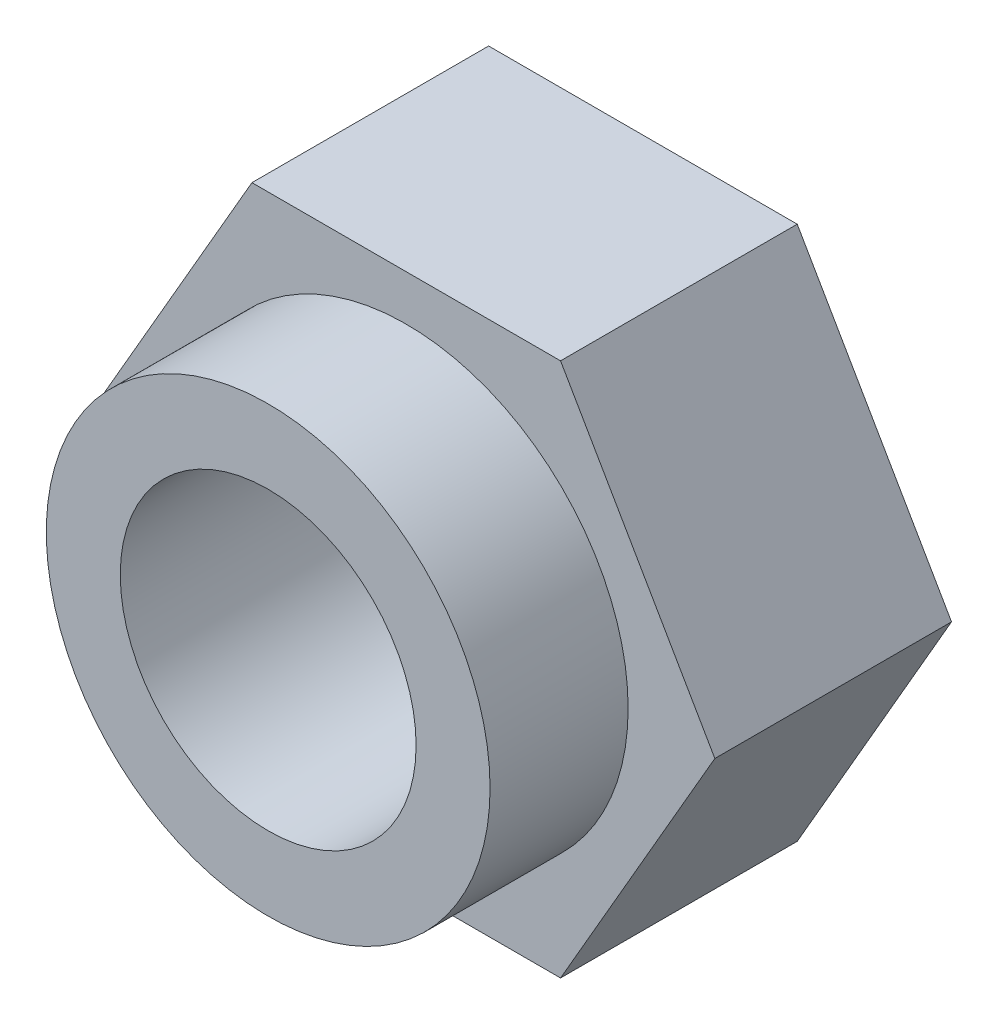
ISO-10303-21;
HEADER;
FILE_DESCRIPTION(('STEP AP214'),'2;1');
FILE_NAME('part.step','',(''),(''),'','','');
FILE_SCHEMA(('AUTOMOTIVE_DESIGN { 1 0 10303 214 1 1 1 1 }'));
ENDSEC;
DATA;
#1=APPLICATION_CONTEXT('core data for automotive mechanical design processes');
#2=APPLICATION_PROTOCOL_DEFINITION('international standard','automotive_design',2000,#1);
#3=PRODUCT_CONTEXT('',#1,'mechanical');
#4=PRODUCT('Part','Part','',(#3));
#5=PRODUCT_RELATED_PRODUCT_CATEGORY('part','',(#4));
#6=PRODUCT_DEFINITION_FORMATION('','',#4);
#7=PRODUCT_DEFINITION_CONTEXT('part definition',#1,'design');
#8=PRODUCT_DEFINITION('design','',#6,#7);
#9=PRODUCT_DEFINITION_SHAPE('','',#8);
#10=(LENGTH_UNIT() NAMED_UNIT(*) SI_UNIT(.MILLI.,.METRE.));
#11=(NAMED_UNIT(*) PLANE_ANGLE_UNIT() SI_UNIT($,.RADIAN.));
#12=(NAMED_UNIT(*) SI_UNIT($,.STERADIAN.) SOLID_ANGLE_UNIT());
#13=UNCERTAINTY_MEASURE_WITH_UNIT(LENGTH_MEASURE(1.E-05),#10,'distance_accuracy_value','');
#14=(GEOMETRIC_REPRESENTATION_CONTEXT(3) GLOBAL_UNCERTAINTY_ASSIGNED_CONTEXT((#13)) GLOBAL_UNIT_ASSIGNED_CONTEXT((#10,
#11,#12)) REPRESENTATION_CONTEXT('',''));
#15=CARTESIAN_POINT('',(0.,0.,0.));
#16=DIRECTION('',(0.,0.,1.));
#17=DIRECTION('',(1.,0.,0.));
#18=AXIS2_PLACEMENT_3D('',#15,#16,#17);
#19=CARTESIAN_POINT('',(1.56461922950391,-2.70999999999997,2.4));
#20=DIRECTION('',(-0.866025403784441,0.499999999999995,0.));
#21=DIRECTION('',(-0.499999999999995,-0.866025403784442,0.));
#22=AXIS2_PLACEMENT_3D('',#19,#20,#21);
#23=PLANE('',#22);
#24=DIRECTION('',(0.499999999999995,0.866025403784442,0.));
#25=VECTOR('',#24,1.);
#26=CARTESIAN_POINT('',(1.56461922950391,-2.70999999999997,0.));
#27=LINE('',#26,#25);
#28=CARTESIAN_POINT('',(1.56461922950391,-2.70999999999997,0.));
#29=VERTEX_POINT('',#28);
#30=CARTESIAN_POINT('',(3.12923845900776,0.,0.));
#31=VERTEX_POINT('',#30);
#32=EDGE_CURVE('E120',#29,#31,#27,.T.);
#33=ORIENTED_EDGE('',*,*,#32,.T.);
#34=DIRECTION('',(0.,0.,-1.));
#35=VECTOR('',#34,1.);
#36=CARTESIAN_POINT('',(3.12923845900776,0.,2.4));
#37=LINE('',#36,#35);
#38=CARTESIAN_POINT('',(3.12923845900776,0.,2.4));
#39=VERTEX_POINT('',#38);
#40=EDGE_CURVE('E37',#39,#31,#37,.T.);
#41=ORIENTED_EDGE('',*,*,#40,.F.);
#42=DIRECTION('',(0.499999999999995,0.866025403784442,0.));
#43=VECTOR('',#42,1.);
#44=CARTESIAN_POINT('',(1.56461922950391,-2.70999999999997,2.4));
#45=LINE('',#44,#43);
#46=CARTESIAN_POINT('',(1.56461922950391,-2.70999999999997,2.4));
#47=VERTEX_POINT('',#46);
#48=EDGE_CURVE('E131',#47,#39,#45,.T.);
#49=ORIENTED_EDGE('',*,*,#48,.F.);
#50=DIRECTION('',(0.,0.,-1.));
#51=VECTOR('',#50,1.);
#52=CARTESIAN_POINT('',(1.56461922950391,-2.70999999999997,2.4));
#53=LINE('',#52,#51);
#54=EDGE_CURVE('E116',#47,#29,#53,.T.);
#55=ORIENTED_EDGE('',*,*,#54,.T.);
#56=EDGE_LOOP('',(#33,#41,#49,#55));
#57=FACE_BOUND('',#56,.T.);
#58=ADVANCED_FACE('F34',(#57),#23,.F.);
#59=CARTESIAN_POINT('',(3.12923845900776,0.,2.4));
#60=DIRECTION('',(-0.866025403784438,-0.500000000000001,0.));
#61=DIRECTION('',(0.500000000000001,-0.866025403784438,0.));
#62=AXIS2_PLACEMENT_3D('',#59,#60,#61);
#63=PLANE('',#62);
#64=DIRECTION('',(-0.500000000000001,0.866025403784438,0.));
#65=VECTOR('',#64,1.);
#66=CARTESIAN_POINT('',(3.12923845900776,0.,0.));
#67=LINE('',#66,#65);
#68=CARTESIAN_POINT('',(1.56461922950387,2.70999999999999,0.));
#69=VERTEX_POINT('',#68);
#70=EDGE_CURVE('E123',#31,#69,#67,.T.);
#71=ORIENTED_EDGE('',*,*,#70,.T.);
#72=DIRECTION('',(0.,0.,-1.));
#73=VECTOR('',#72,1.);
#74=CARTESIAN_POINT('',(1.56461922950387,2.70999999999999,2.4));
#75=LINE('',#74,#73);
#76=CARTESIAN_POINT('',(1.56461922950387,2.70999999999999,2.4));
#77=VERTEX_POINT('',#76);
#78=EDGE_CURVE('E134',#77,#69,#75,.T.);
#79=ORIENTED_EDGE('',*,*,#78,.F.);
#80=DIRECTION('',(-0.500000000000001,0.866025403784438,0.));
#81=VECTOR('',#80,1.);
#82=CARTESIAN_POINT('',(3.12923845900776,0.,2.4));
#83=LINE('',#82,#81);
#84=EDGE_CURVE('E89',#39,#77,#83,.T.);
#85=ORIENTED_EDGE('',*,*,#84,.F.);
#86=ORIENTED_EDGE('',*,*,#40,.T.);
#87=EDGE_LOOP('',(#71,#79,#85,#86));
#88=FACE_BOUND('',#87,.T.);
#89=ADVANCED_FACE('F139',(#88),#63,.F.);
#90=CARTESIAN_POINT('',(1.56461922950387,2.70999999999999,2.4));
#91=DIRECTION('',(0.,-1.,0.));
#92=DIRECTION('',(1.,0.,0.));
#93=AXIS2_PLACEMENT_3D('',#90,#91,#92);
#94=PLANE('',#93);
#95=DIRECTION('',(-1.,0.,0.));
#96=VECTOR('',#95,1.);
#97=CARTESIAN_POINT('',(1.56461922950387,2.70999999999999,0.));
#98=LINE('',#97,#96);
#99=CARTESIAN_POINT('',(-1.56461922950389,2.70999999999998,0.));
#100=VERTEX_POINT('',#99);
#101=EDGE_CURVE('E126',#69,#100,#98,.T.);
#102=ORIENTED_EDGE('',*,*,#101,.T.);
#103=DIRECTION('',(0.,0.,-1.));
#104=VECTOR('',#103,1.);
#105=CARTESIAN_POINT('',(-1.56461922950389,2.70999999999998,2.4));
#106=LINE('',#105,#104);
#107=CARTESIAN_POINT('',(-1.56461922950389,2.70999999999998,2.4));
#108=VERTEX_POINT('',#107);
#109=EDGE_CURVE('E111',#108,#100,#106,.T.);
#110=ORIENTED_EDGE('',*,*,#109,.F.);
#111=DIRECTION('',(-1.,0.,0.));
#112=VECTOR('',#111,1.);
#113=CARTESIAN_POINT('',(1.56461922950387,2.70999999999999,2.4));
#114=LINE('',#113,#112);
#115=EDGE_CURVE('E102',#77,#108,#114,.T.);
#116=ORIENTED_EDGE('',*,*,#115,.F.);
#117=ORIENTED_EDGE('',*,*,#78,.T.);
#118=EDGE_LOOP('',(#102,#110,#116,#117));
#119=FACE_BOUND('',#118,.T.);
#120=ADVANCED_FACE('F145',(#119),#94,.F.);
#121=CARTESIAN_POINT('',(-1.56461922950389,2.70999999999998,2.4));
#122=DIRECTION('',(0.866025403784441,-0.499999999999995,0.));
#123=DIRECTION('',(0.499999999999995,0.866025403784442,0.));
#124=AXIS2_PLACEMENT_3D('',#121,#122,#123);
#125=PLANE('',#124);
#126=DIRECTION('',(-0.499999999999995,-0.866025403784441,0.));
#127=VECTOR('',#126,1.);
#128=CARTESIAN_POINT('',(-1.56461922950389,2.70999999999998,0.));
#129=LINE('',#128,#127);
#130=CARTESIAN_POINT('',(-3.12923845900776,0.,0.));
#131=VERTEX_POINT('',#130);
#132=EDGE_CURVE('E110',#100,#131,#129,.T.);
#133=ORIENTED_EDGE('',*,*,#132,.T.);
#134=DIRECTION('',(0.,0.,-1.));
#135=VECTOR('',#134,1.);
#136=CARTESIAN_POINT('',(-3.12923845900776,0.,2.4));
#137=LINE('',#136,#135);
#138=CARTESIAN_POINT('',(-3.12923845900776,0.,2.4));
#139=VERTEX_POINT('',#138);
#140=EDGE_CURVE('E107',#139,#131,#137,.T.);
#141=ORIENTED_EDGE('',*,*,#140,.F.);
#142=DIRECTION('',(-0.499999999999995,-0.866025403784441,0.));
#143=VECTOR('',#142,1.);
#144=CARTESIAN_POINT('',(-1.56461922950389,2.70999999999998,2.4));
#145=LINE('',#144,#143);
#146=EDGE_CURVE('E96',#108,#139,#145,.T.);
#147=ORIENTED_EDGE('',*,*,#146,.F.);
#148=ORIENTED_EDGE('',*,*,#109,.T.);
#149=EDGE_LOOP('',(#133,#141,#147,#148));
#150=FACE_BOUND('',#149,.T.);
#151=ADVANCED_FACE('F108',(#150),#125,.F.);
#152=CARTESIAN_POINT('',(-3.12923845900776,0.,2.4));
#153=DIRECTION('',(0.866025403784434,0.500000000000007,0.));
#154=DIRECTION('',(-0.500000000000007,0.866025403784435,0.));
#155=AXIS2_PLACEMENT_3D('',#152,#153,#154);
#156=PLANE('',#155);
#157=DIRECTION('',(0.500000000000007,-0.866025403784435,0.));
#158=VECTOR('',#157,1.);
#159=CARTESIAN_POINT('',(-3.12923845900776,0.,0.));
#160=LINE('',#159,#158);
#161=CARTESIAN_POINT('',(-1.56461922950386,-2.71000000000001,0.));
#162=VERTEX_POINT('',#161);
#163=EDGE_CURVE('E74',#131,#162,#160,.T.);
#164=ORIENTED_EDGE('',*,*,#163,.T.);
#165=DIRECTION('',(0.,0.,-1.));
#166=VECTOR('',#165,1.);
#167=CARTESIAN_POINT('',(-1.56461922950386,-2.71000000000001,2.4));
#168=LINE('',#167,#166);
#169=CARTESIAN_POINT('',(-1.56461922950386,-2.71000000000001,2.4));
#170=VERTEX_POINT('',#169);
#171=EDGE_CURVE('E112',#170,#162,#168,.T.);
#172=ORIENTED_EDGE('',*,*,#171,.F.);
#173=DIRECTION('',(0.500000000000007,-0.866025403784435,0.));
#174=VECTOR('',#173,1.);
#175=CARTESIAN_POINT('',(-3.12923845900776,0.,2.4));
#176=LINE('',#175,#174);
#177=EDGE_CURVE('E100',#139,#170,#176,.T.);
#178=ORIENTED_EDGE('',*,*,#177,.F.);
#179=ORIENTED_EDGE('',*,*,#140,.T.);
#180=EDGE_LOOP('',(#164,#172,#178,#179));
#181=FACE_BOUND('',#180,.T.);
#182=ADVANCED_FACE('F114',(#181),#156,.F.);
#183=CARTESIAN_POINT('',(-1.56461922950386,-2.71000000000001,2.4));
#184=DIRECTION('',(0.,1.,0.));
#185=DIRECTION('',(-1.,0.,0.));
#186=AXIS2_PLACEMENT_3D('',#183,#184,#185);
#187=PLANE('',#186);
#188=DIRECTION('',(1.,0.,0.));
#189=VECTOR('',#188,1.);
#190=CARTESIAN_POINT('',(-1.56461922950386,-2.71000000000001,0.));
#191=LINE('',#190,#189);
#192=EDGE_CURVE('E80',#162,#29,#191,.T.);
#193=ORIENTED_EDGE('',*,*,#192,.T.);
#194=ORIENTED_EDGE('',*,*,#54,.F.);
#195=DIRECTION('',(1.,0.,0.));
#196=VECTOR('',#195,1.);
#197=CARTESIAN_POINT('',(-1.56461922950386,-2.71000000000001,2.4));
#198=LINE('',#197,#196);
#199=EDGE_CURVE('E51',#170,#47,#198,.T.);
#200=ORIENTED_EDGE('',*,*,#199,.F.);
#201=ORIENTED_EDGE('',*,*,#171,.T.);
#202=EDGE_LOOP('',(#193,#194,#200,#201));
#203=FACE_BOUND('',#202,.T.);
#204=ADVANCED_FACE('F174',(#203),#187,.F.);
#205=CARTESIAN_POINT('',(0.,0.,2.4));
#206=DIRECTION('',(0.,0.,1.));
#207=DIRECTION('',(1.,0.,0.));
#208=AXIS2_PLACEMENT_3D('',#205,#206,#207);
#209=PLANE('',#208);
#210=CARTESIAN_POINT('',(0.,0.,2.4));
#211=DIRECTION('',(0.,0.,1.));
#212=DIRECTION('',(1.,0.,0.));
#213=AXIS2_PLACEMENT_3D('',#210,#211,#212);
#214=CIRCLE('',#213,2.25);
#215=CARTESIAN_POINT('',(2.25,0.,2.4));
#216=VERTEX_POINT('',#215);
#217=EDGE_CURVE('E11',#216,#216,#214,.T.);
#218=ORIENTED_EDGE('',*,*,#217,.F.);
#219=EDGE_LOOP('',(#218));
#220=FACE_BOUND('',#219,.T.);
#221=ORIENTED_EDGE('',*,*,#48,.T.);
#222=ORIENTED_EDGE('',*,*,#84,.T.);
#223=ORIENTED_EDGE('',*,*,#115,.T.);
#224=ORIENTED_EDGE('',*,*,#146,.T.);
#225=ORIENTED_EDGE('',*,*,#177,.T.);
#226=ORIENTED_EDGE('',*,*,#199,.T.);
#227=EDGE_LOOP('',(#221,#222,#223,#224,#225,#226));
#228=FACE_BOUND('',#227,.T.);
#229=ADVANCED_FACE('F98',(#220,#228),#209,.T.);
#230=CARTESIAN_POINT('',(0.,0.,0.));
#231=DIRECTION('',(0.,0.,1.));
#232=DIRECTION('',(1.,0.,0.));
#233=AXIS2_PLACEMENT_3D('',#230,#231,#232);
#234=PLANE('',#233);
#235=CARTESIAN_POINT('',(0.,0.,0.));
#236=DIRECTION('',(0.,0.,1.));
#237=DIRECTION('',(1.,0.,0.));
#238=AXIS2_PLACEMENT_3D('',#235,#236,#237);
#239=CIRCLE('',#238,1.5);
#240=CARTESIAN_POINT('',(1.5,0.,0.));
#241=VERTEX_POINT('',#240);
#242=EDGE_CURVE('E151',#241,#241,#239,.T.);
#243=ORIENTED_EDGE('',*,*,#242,.T.);
#244=EDGE_LOOP('',(#243));
#245=FACE_BOUND('',#244,.T.);
#246=ORIENTED_EDGE('',*,*,#32,.F.);
#247=ORIENTED_EDGE('',*,*,#192,.F.);
#248=ORIENTED_EDGE('',*,*,#163,.F.);
#249=ORIENTED_EDGE('',*,*,#132,.F.);
#250=ORIENTED_EDGE('',*,*,#101,.F.);
#251=ORIENTED_EDGE('',*,*,#70,.F.);
#252=EDGE_LOOP('',(#246,#247,#248,#249,#250,#251));
#253=FACE_BOUND('',#252,.T.);
#254=ADVANCED_FACE('F144',(#245,#253),#234,.F.);
#255=CARTESIAN_POINT('',(0.,0.,3.8));
#256=DIRECTION('',(0.,0.,-1.));
#257=DIRECTION('',(-1.,0.,0.));
#258=AXIS2_PLACEMENT_3D('',#255,#256,#257);
#259=CYLINDRICAL_SURFACE('',#258,2.25);
#260=CARTESIAN_POINT('',(0.,0.,3.8));
#261=DIRECTION('',(0.,0.,1.));
#262=DIRECTION('',(1.,0.,0.));
#263=AXIS2_PLACEMENT_3D('',#260,#261,#262);
#264=CIRCLE('',#263,2.25);
#265=CARTESIAN_POINT('',(2.25,0.,3.8));
#266=VERTEX_POINT('',#265);
#267=EDGE_CURVE('E124',#266,#266,#264,.T.);
#268=ORIENTED_EDGE('',*,*,#267,.F.);
#269=EDGE_LOOP('',(#268));
#270=FACE_BOUND('',#269,.T.);
#271=ORIENTED_EDGE('',*,*,#217,.T.);
#272=EDGE_LOOP('',(#271));
#273=FACE_BOUND('',#272,.T.);
#274=ADVANCED_FACE('F164',(#270,#273),#259,.T.);
#275=CARTESIAN_POINT('',(0.,0.,3.8));
#276=DIRECTION('',(0.,0.,1.));
#277=DIRECTION('',(1.,0.,0.));
#278=AXIS2_PLACEMENT_3D('',#275,#276,#277);
#279=PLANE('',#278);
#280=CARTESIAN_POINT('',(0.,0.,3.8));
#281=DIRECTION('',(0.,0.,1.));
#282=DIRECTION('',(1.,0.,0.));
#283=AXIS2_PLACEMENT_3D('',#280,#281,#282);
#284=CIRCLE('',#283,1.5);
#285=CARTESIAN_POINT('',(1.5,0.,3.8));
#286=VERTEX_POINT('',#285);
#287=EDGE_CURVE('E154',#286,#286,#284,.T.);
#288=ORIENTED_EDGE('',*,*,#287,.F.);
#289=EDGE_LOOP('',(#288));
#290=FACE_BOUND('',#289,.T.);
#291=ORIENTED_EDGE('',*,*,#267,.T.);
#292=EDGE_LOOP('',(#291));
#293=FACE_BOUND('',#292,.T.);
#294=ADVANCED_FACE('F161',(#290,#293),#279,.T.);
#295=CARTESIAN_POINT('',(0.,0.,-0.6));
#296=DIRECTION('',(0.,0.,1.));
#297=DIRECTION('',(1.,0.,0.));
#298=AXIS2_PLACEMENT_3D('',#295,#296,#297);
#299=CYLINDRICAL_SURFACE('',#298,1.5);
#300=ORIENTED_EDGE('',*,*,#287,.T.);
#301=EDGE_LOOP('',(#300));
#302=FACE_BOUND('',#301,.T.);
#303=ORIENTED_EDGE('',*,*,#242,.F.);
#304=EDGE_LOOP('',(#303));
#305=FACE_BOUND('',#304,.T.);
#306=ADVANCED_FACE('F158',(#302,#305),#299,.F.);
#307=CLOSED_SHELL('',(#58,#89,#120,#151,#182,#204,#229,#254,#274,#294,#306));
#308=MANIFOLD_SOLID_BREP('B2',#307);
#309=ADVANCED_BREP_SHAPE_REPRESENTATION('',(#18,#308),#14);
#310=SHAPE_DEFINITION_REPRESENTATION(#9,#309);
ENDSEC;
END-ISO-10303-21;
